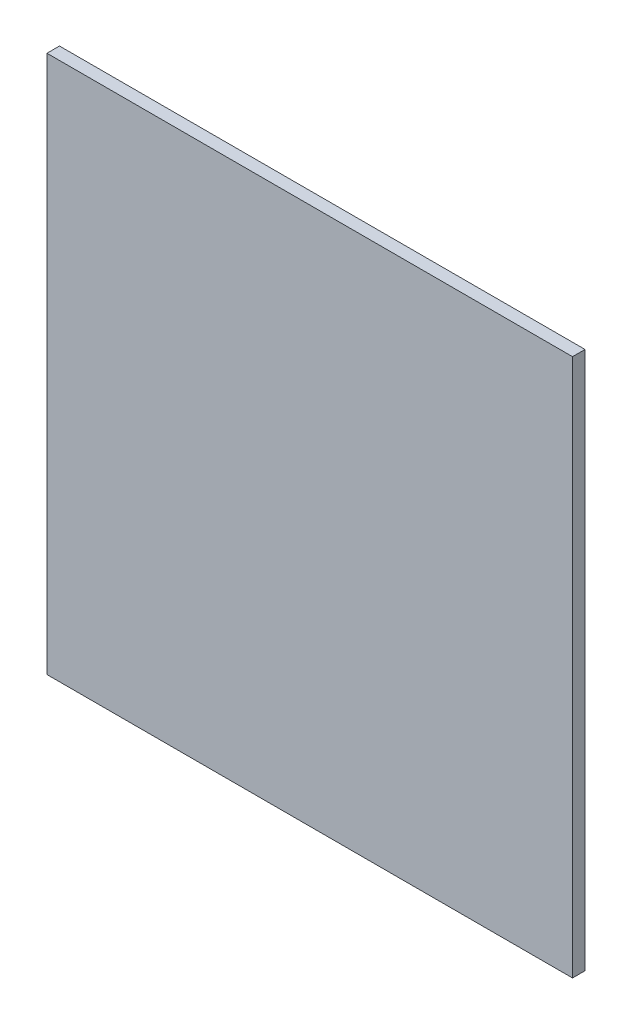
ISO-10303-21;
HEADER;
FILE_DESCRIPTION(('STEP AP214'),'2;1');
FILE_NAME('part.step','',(''),(''),'','','');
FILE_SCHEMA(('AUTOMOTIVE_DESIGN { 1 0 10303 214 1 1 1 1 }'));
ENDSEC;
DATA;
#1=APPLICATION_CONTEXT('core data for automotive mechanical design processes');
#2=APPLICATION_PROTOCOL_DEFINITION('international standard','automotive_design',2000,#1);
#3=PRODUCT_CONTEXT('',#1,'mechanical');
#4=PRODUCT('Part','Part','',(#3));
#5=PRODUCT_RELATED_PRODUCT_CATEGORY('part','',(#4));
#6=PRODUCT_DEFINITION_FORMATION('','',#4);
#7=PRODUCT_DEFINITION_CONTEXT('part definition',#1,'design');
#8=PRODUCT_DEFINITION('design','',#6,#7);
#9=PRODUCT_DEFINITION_SHAPE('','',#8);
#10=(LENGTH_UNIT() NAMED_UNIT(*) SI_UNIT(.MILLI.,.METRE.));
#11=(NAMED_UNIT(*) PLANE_ANGLE_UNIT() SI_UNIT($,.RADIAN.));
#12=(NAMED_UNIT(*) SI_UNIT($,.STERADIAN.) SOLID_ANGLE_UNIT());
#13=UNCERTAINTY_MEASURE_WITH_UNIT(LENGTH_MEASURE(1.E-05),#10,'distance_accuracy_value','');
#14=(GEOMETRIC_REPRESENTATION_CONTEXT(3) GLOBAL_UNCERTAINTY_ASSIGNED_CONTEXT((#13)) GLOBAL_UNIT_ASSIGNED_CONTEXT((#10,
#11,#12)) REPRESENTATION_CONTEXT('',''));
#15=CARTESIAN_POINT('',(0.,0.,0.));
#16=DIRECTION('',(0.,0.,1.));
#17=DIRECTION('',(1.,0.,0.));
#18=AXIS2_PLACEMENT_3D('',#15,#16,#17);
#19=CARTESIAN_POINT('',(-1.8471,-2.3971,0.1));
#20=DIRECTION('',(0.,0.,1.));
#21=DIRECTION('',(1.,0.,0.));
#22=AXIS2_PLACEMENT_3D('',#19,#20,#21);
#23=PLANE('',#22);
#24=DIRECTION('',(1.,0.,0.));
#25=VECTOR('',#24,1.);
#26=CARTESIAN_POINT('',(-1.8471,1.8971,0.1));
#27=LINE('',#26,#25);
#28=CARTESIAN_POINT('',(-1.8471,1.8971,0.1));
#29=VERTEX_POINT('',#28);
#30=CARTESIAN_POINT('',(2.3471,1.8971,0.1));
#31=VERTEX_POINT('',#30);
#32=EDGE_CURVE('E53',#29,#31,#27,.T.);
#33=ORIENTED_EDGE('',*,*,#32,.F.);
#34=DIRECTION('',(0.,1.,0.));
#35=VECTOR('',#34,1.);
#36=CARTESIAN_POINT('',(-1.8471,-2.3971,0.1));
#37=LINE('',#36,#35);
#38=CARTESIAN_POINT('',(-1.8471,-2.3971,0.1));
#39=VERTEX_POINT('',#38);
#40=EDGE_CURVE('E68',#39,#29,#37,.T.);
#41=ORIENTED_EDGE('',*,*,#40,.F.);
#42=DIRECTION('',(1.,0.,0.));
#43=VECTOR('',#42,1.);
#44=CARTESIAN_POINT('',(2.3471,-2.3971,0.1));
#45=LINE('',#44,#43);
#46=CARTESIAN_POINT('',(2.3471,-2.3971,0.1));
#47=VERTEX_POINT('',#46);
#48=EDGE_CURVE('E20',#47,#39,#45,.F.);
#49=ORIENTED_EDGE('',*,*,#48,.F.);
#50=DIRECTION('',(0.,1.,0.));
#51=VECTOR('',#50,1.);
#52=CARTESIAN_POINT('',(2.3471,1.8971,0.1));
#53=LINE('',#52,#51);
#54=EDGE_CURVE('E58',#31,#47,#53,.F.);
#55=ORIENTED_EDGE('',*,*,#54,.F.);
#56=EDGE_LOOP('',(#33,#41,#49,#55));
#57=FACE_BOUND('',#56,.T.);
#58=ADVANCED_FACE('F17',(#57),#23,.T.);
#59=CARTESIAN_POINT('',(2.3471,-2.3971,0.));
#60=DIRECTION('',(0.,-1.,0.));
#61=DIRECTION('',(0.,0.,-1.));
#62=AXIS2_PLACEMENT_3D('',#59,#60,#61);
#63=PLANE('',#62);
#64=DIRECTION('',(0.,0.,1.));
#65=VECTOR('',#64,1.);
#66=CARTESIAN_POINT('',(-1.8471,-2.3971,0.));
#67=LINE('',#66,#65);
#68=CARTESIAN_POINT('',(-1.8471,-2.3971,0.));
#69=VERTEX_POINT('',#68);
#70=EDGE_CURVE('E79',#69,#39,#67,.T.);
#71=ORIENTED_EDGE('',*,*,#70,.F.);
#72=DIRECTION('',(1.,0.,0.));
#73=VECTOR('',#72,1.);
#74=CARTESIAN_POINT('',(-1.8471,-2.3971,0.));
#75=LINE('',#74,#73);
#76=CARTESIAN_POINT('',(2.3471,-2.3971,0.));
#77=VERTEX_POINT('',#76);
#78=EDGE_CURVE('E74',#69,#77,#75,.T.);
#79=ORIENTED_EDGE('',*,*,#78,.T.);
#80=DIRECTION('',(0.,0.,-1.));
#81=VECTOR('',#80,1.);
#82=CARTESIAN_POINT('',(2.3471,-2.3971,0.));
#83=LINE('',#82,#81);
#84=EDGE_CURVE('E63',#47,#77,#83,.T.);
#85=ORIENTED_EDGE('',*,*,#84,.F.);
#86=ORIENTED_EDGE('',*,*,#48,.T.);
#87=EDGE_LOOP('',(#71,#79,#85,#86));
#88=FACE_BOUND('',#87,.T.);
#89=ADVANCED_FACE('F73',(#88),#63,.T.);
#90=CARTESIAN_POINT('',(2.3471,1.8971,0.));
#91=DIRECTION('',(1.,0.,0.));
#92=DIRECTION('',(0.,0.,-1.));
#93=AXIS2_PLACEMENT_3D('',#90,#91,#92);
#94=PLANE('',#93);
#95=ORIENTED_EDGE('',*,*,#84,.T.);
#96=DIRECTION('',(0.,1.,0.));
#97=VECTOR('',#96,1.);
#98=CARTESIAN_POINT('',(2.3471,-2.3971,0.));
#99=LINE('',#98,#97);
#100=CARTESIAN_POINT('',(2.3471,1.8971,0.));
#101=VERTEX_POINT('',#100);
#102=EDGE_CURVE('E84',#77,#101,#99,.T.);
#103=ORIENTED_EDGE('',*,*,#102,.T.);
#104=DIRECTION('',(0.,0.,1.));
#105=VECTOR('',#104,1.);
#106=CARTESIAN_POINT('',(2.3471,1.8971,0.));
#107=LINE('',#106,#105);
#108=EDGE_CURVE('E65',#31,#101,#107,.F.);
#109=ORIENTED_EDGE('',*,*,#108,.F.);
#110=ORIENTED_EDGE('',*,*,#54,.T.);
#111=EDGE_LOOP('',(#95,#103,#109,#110));
#112=FACE_BOUND('',#111,.T.);
#113=ADVANCED_FACE('F60',(#112),#94,.T.);
#114=CARTESIAN_POINT('',(-1.8471,1.8971,0.));
#115=DIRECTION('',(0.,1.,0.));
#116=DIRECTION('',(0.,0.,1.));
#117=AXIS2_PLACEMENT_3D('',#114,#115,#116);
#118=PLANE('',#117);
#119=ORIENTED_EDGE('',*,*,#108,.T.);
#120=DIRECTION('',(1.,0.,0.));
#121=VECTOR('',#120,1.);
#122=CARTESIAN_POINT('',(-1.8471,1.8971,0.));
#123=LINE('',#122,#121);
#124=CARTESIAN_POINT('',(-1.8471,1.8971,0.));
#125=VERTEX_POINT('',#124);
#126=EDGE_CURVE('E26',#101,#125,#123,.F.);
#127=ORIENTED_EDGE('',*,*,#126,.T.);
#128=DIRECTION('',(0.,0.,1.));
#129=VECTOR('',#128,1.);
#130=CARTESIAN_POINT('',(-1.8471,1.8971,0.));
#131=LINE('',#130,#129);
#132=EDGE_CURVE('E34',#29,#125,#131,.F.);
#133=ORIENTED_EDGE('',*,*,#132,.F.);
#134=ORIENTED_EDGE('',*,*,#32,.T.);
#135=EDGE_LOOP('',(#119,#127,#133,#134));
#136=FACE_BOUND('',#135,.T.);
#137=ADVANCED_FACE('F88',(#136),#118,.T.);
#138=CARTESIAN_POINT('',(-1.8471,-2.3971,0.));
#139=DIRECTION('',(-1.,0.,0.));
#140=DIRECTION('',(0.,0.,1.));
#141=AXIS2_PLACEMENT_3D('',#138,#139,#140);
#142=PLANE('',#141);
#143=ORIENTED_EDGE('',*,*,#132,.T.);
#144=DIRECTION('',(0.,1.,0.));
#145=VECTOR('',#144,1.);
#146=CARTESIAN_POINT('',(-1.8471,-2.3971,0.));
#147=LINE('',#146,#145);
#148=EDGE_CURVE('E11',#125,#69,#147,.F.);
#149=ORIENTED_EDGE('',*,*,#148,.T.);
#150=ORIENTED_EDGE('',*,*,#70,.T.);
#151=ORIENTED_EDGE('',*,*,#40,.T.);
#152=EDGE_LOOP('',(#143,#149,#150,#151));
#153=FACE_BOUND('',#152,.T.);
#154=ADVANCED_FACE('F91',(#153),#142,.T.);
#155=CARTESIAN_POINT('',(-1.8471,-2.3971,0.));
#156=DIRECTION('',(0.,0.,1.));
#157=DIRECTION('',(1.,0.,0.));
#158=AXIS2_PLACEMENT_3D('',#155,#156,#157);
#159=PLANE('',#158);
#160=ORIENTED_EDGE('',*,*,#126,.F.);
#161=ORIENTED_EDGE('',*,*,#102,.F.);
#162=ORIENTED_EDGE('',*,*,#78,.F.);
#163=ORIENTED_EDGE('',*,*,#148,.F.);
#164=EDGE_LOOP('',(#160,#161,#162,#163));
#165=FACE_BOUND('',#164,.T.);
#166=ADVANCED_FACE('F90',(#165),#159,.F.);
#167=CLOSED_SHELL('',(#58,#89,#113,#137,#154,#166));
#168=MANIFOLD_SOLID_BREP('B1',#167);
#169=ADVANCED_BREP_SHAPE_REPRESENTATION('',(#18,#168),#14);
#170=SHAPE_DEFINITION_REPRESENTATION(#9,#169);
ENDSEC;
END-ISO-10303-21;
